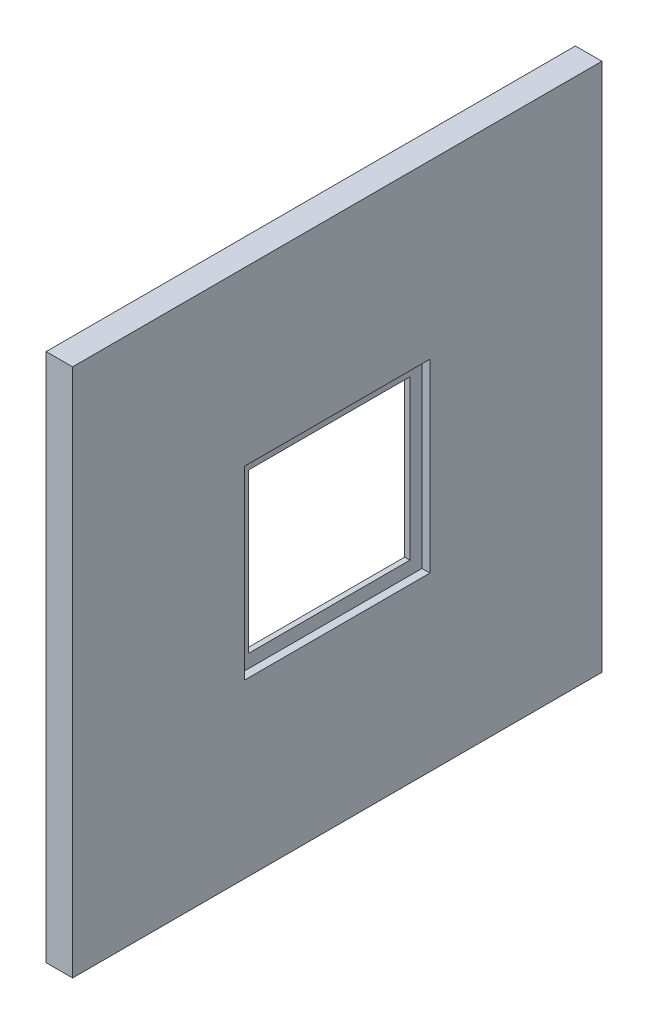
ISO-10303-21;
HEADER;
FILE_DESCRIPTION(('STEP AP214'),'2;1');
FILE_NAME('part.step','',(''),(''),'','','');
FILE_SCHEMA(('AUTOMOTIVE_DESIGN { 1 0 10303 214 1 1 1 1 }'));
ENDSEC;
DATA;
#1=APPLICATION_CONTEXT('core data for automotive mechanical design processes');
#2=APPLICATION_PROTOCOL_DEFINITION('international standard','automotive_design',2000,#1);
#3=PRODUCT_CONTEXT('',#1,'mechanical');
#4=PRODUCT('Part','Part','',(#3));
#5=PRODUCT_RELATED_PRODUCT_CATEGORY('part','',(#4));
#6=PRODUCT_DEFINITION_FORMATION('','',#4);
#7=PRODUCT_DEFINITION_CONTEXT('part definition',#1,'design');
#8=PRODUCT_DEFINITION('design','',#6,#7);
#9=PRODUCT_DEFINITION_SHAPE('','',#8);
#10=(LENGTH_UNIT() NAMED_UNIT(*) SI_UNIT(.MILLI.,.METRE.));
#11=(NAMED_UNIT(*) PLANE_ANGLE_UNIT() SI_UNIT($,.RADIAN.));
#12=(NAMED_UNIT(*) SI_UNIT($,.STERADIAN.) SOLID_ANGLE_UNIT());
#13=UNCERTAINTY_MEASURE_WITH_UNIT(LENGTH_MEASURE(1.E-05),#10,'distance_accuracy_value','');
#14=(GEOMETRIC_REPRESENTATION_CONTEXT(3) GLOBAL_UNCERTAINTY_ASSIGNED_CONTEXT((#13)) GLOBAL_UNIT_ASSIGNED_CONTEXT((#10,
#11,#12)) REPRESENTATION_CONTEXT('',''));
#15=CARTESIAN_POINT('',(0.,0.,0.));
#16=DIRECTION('',(0.,0.,1.));
#17=DIRECTION('',(1.,0.,0.));
#18=AXIS2_PLACEMENT_3D('',#15,#16,#17);
#19=CARTESIAN_POINT('',(10.,30.,-30.5107562106538));
#20=DIRECTION('',(0.,0.,-1.));
#21=DIRECTION('',(0.,1.,0.));
#22=AXIS2_PLACEMENT_3D('',#19,#20,#21);
#23=PLANE('',#22);
#24=DIRECTION('',(0.,-1.,0.));
#25=VECTOR('',#24,1.);
#26=CARTESIAN_POINT('',(7.,30.,-30.5107562106538));
#27=LINE('',#26,#25);
#28=CARTESIAN_POINT('',(7.,30.,-30.5107562106538));
#29=VERTEX_POINT('',#28);
#30=CARTESIAN_POINT('',(7.,-30.,-30.5107562106538));
#31=VERTEX_POINT('',#30);
#32=EDGE_CURVE('E62',#29,#31,#27,.T.);
#33=ORIENTED_EDGE('',*,*,#32,.F.);
#34=DIRECTION('',(-1.,0.,0.));
#35=VECTOR('',#34,1.);
#36=CARTESIAN_POINT('',(10.,30.,-30.5107562106538));
#37=LINE('',#36,#35);
#38=CARTESIAN_POINT('',(5.,30.,-30.5107562106538));
#39=VERTEX_POINT('',#38);
#40=EDGE_CURVE('E251',#29,#39,#37,.T.);
#41=ORIENTED_EDGE('',*,*,#40,.T.);
#42=DIRECTION('',(0.,-1.,0.));
#43=VECTOR('',#42,1.);
#44=CARTESIAN_POINT('',(5.,30.,-30.5107562106538));
#45=LINE('',#44,#43);
#46=CARTESIAN_POINT('',(5.,-30.,-30.5107562106538));
#47=VERTEX_POINT('',#46);
#48=EDGE_CURVE('E234',#39,#47,#45,.T.);
#49=ORIENTED_EDGE('',*,*,#48,.T.);
#50=DIRECTION('',(-1.,0.,0.));
#51=VECTOR('',#50,1.);
#52=CARTESIAN_POINT('',(10.,-30.,-30.5107562106538));
#53=LINE('',#52,#51);
#54=EDGE_CURVE('E250',#31,#47,#53,.T.);
#55=ORIENTED_EDGE('',*,*,#54,.F.);
#56=EDGE_LOOP('',(#33,#41,#49,#55));
#57=FACE_BOUND('',#56,.T.);
#58=ADVANCED_FACE('F39',(#57),#23,.F.);
#59=CARTESIAN_POINT('',(10.,30.,-30.5107562106538));
#60=DIRECTION('',(0.,1.,0.));
#61=DIRECTION('',(0.,0.,1.));
#62=AXIS2_PLACEMENT_3D('',#59,#60,#61);
#63=PLANE('',#62);
#64=DIRECTION('',(0.,0.,-1.));
#65=VECTOR('',#64,1.);
#66=CARTESIAN_POINT('',(7.,30.,-30.5107562106538));
#67=LINE('',#66,#65);
#68=CARTESIAN_POINT('',(7.,30.,30.5107562106538));
#69=VERTEX_POINT('',#68);
#70=EDGE_CURVE('E229',#69,#29,#67,.T.);
#71=ORIENTED_EDGE('',*,*,#70,.F.);
#72=DIRECTION('',(-1.,0.,0.));
#73=VECTOR('',#72,1.);
#74=CARTESIAN_POINT('',(10.,30.,30.5107562106538));
#75=LINE('',#74,#73);
#76=CARTESIAN_POINT('',(5.,30.,30.5107562106538));
#77=VERTEX_POINT('',#76);
#78=EDGE_CURVE('E255',#69,#77,#75,.T.);
#79=ORIENTED_EDGE('',*,*,#78,.T.);
#80=DIRECTION('',(0.,0.,-1.));
#81=VECTOR('',#80,1.);
#82=CARTESIAN_POINT('',(5.,30.,-30.5107562106538));
#83=LINE('',#82,#81);
#84=EDGE_CURVE('E246',#77,#39,#83,.T.);
#85=ORIENTED_EDGE('',*,*,#84,.T.);
#86=ORIENTED_EDGE('',*,*,#40,.F.);
#87=EDGE_LOOP('',(#71,#79,#85,#86));
#88=FACE_BOUND('',#87,.T.);
#89=ADVANCED_FACE('F421',(#88),#63,.F.);
#90=CARTESIAN_POINT('',(10.,30.,30.5107562106538));
#91=DIRECTION('',(0.,0.,1.));
#92=DIRECTION('',(0.,-1.,0.));
#93=AXIS2_PLACEMENT_3D('',#90,#91,#92);
#94=PLANE('',#93);
#95=DIRECTION('',(0.,1.,0.));
#96=VECTOR('',#95,1.);
#97=CARTESIAN_POINT('',(7.,30.,30.5107562106538));
#98=LINE('',#97,#96);
#99=CARTESIAN_POINT('',(7.,-30.,30.5107562106538));
#100=VERTEX_POINT('',#99);
#101=EDGE_CURVE('E221',#100,#69,#98,.T.);
#102=ORIENTED_EDGE('',*,*,#101,.F.);
#103=DIRECTION('',(-1.,0.,0.));
#104=VECTOR('',#103,1.);
#105=CARTESIAN_POINT('',(10.,-30.,30.5107562106538));
#106=LINE('',#105,#104);
#107=CARTESIAN_POINT('',(5.,-30.,30.5107562106538));
#108=VERTEX_POINT('',#107);
#109=EDGE_CURVE('E258',#100,#108,#106,.T.);
#110=ORIENTED_EDGE('',*,*,#109,.T.);
#111=DIRECTION('',(0.,1.,0.));
#112=VECTOR('',#111,1.);
#113=CARTESIAN_POINT('',(5.,30.,30.5107562106538));
#114=LINE('',#113,#112);
#115=EDGE_CURVE('E242',#108,#77,#114,.T.);
#116=ORIENTED_EDGE('',*,*,#115,.T.);
#117=ORIENTED_EDGE('',*,*,#78,.F.);
#118=EDGE_LOOP('',(#102,#110,#116,#117));
#119=FACE_BOUND('',#118,.T.);
#120=ADVANCED_FACE('F427',(#119),#94,.F.);
#121=CARTESIAN_POINT('',(10.,-30.,-30.5107562106538));
#122=DIRECTION('',(0.,-1.,0.));
#123=DIRECTION('',(0.,0.,-1.));
#124=AXIS2_PLACEMENT_3D('',#121,#122,#123);
#125=PLANE('',#124);
#126=DIRECTION('',(0.,0.,1.));
#127=VECTOR('',#126,1.);
#128=CARTESIAN_POINT('',(7.,-30.,-30.5107562106538));
#129=LINE('',#128,#127);
#130=EDGE_CURVE('E11',#31,#100,#129,.T.);
#131=ORIENTED_EDGE('',*,*,#130,.F.);
#132=ORIENTED_EDGE('',*,*,#54,.T.);
#133=DIRECTION('',(0.,0.,1.));
#134=VECTOR('',#133,1.);
#135=CARTESIAN_POINT('',(5.,-30.,-30.5107562106538));
#136=LINE('',#135,#134);
#137=EDGE_CURVE('E238',#47,#108,#136,.T.);
#138=ORIENTED_EDGE('',*,*,#137,.T.);
#139=ORIENTED_EDGE('',*,*,#109,.F.);
#140=EDGE_LOOP('',(#131,#132,#138,#139));
#141=FACE_BOUND('',#140,.T.);
#142=ADVANCED_FACE('F432',(#141),#125,.F.);
#143=CARTESIAN_POINT('',(0.,0.,0.));
#144=DIRECTION('',(1.,0.,0.));
#145=DIRECTION('',(0.,0.,-1.));
#146=AXIS2_PLACEMENT_3D('',#143,#144,#145);
#147=PLANE('',#146);
#148=DIRECTION('',(0.,-1.,0.));
#149=VECTOR('',#148,1.);
#150=CARTESIAN_POINT('',(0.,100.,100.));
#151=LINE('',#150,#149);
#152=CARTESIAN_POINT('',(0.,100.,100.));
#153=VERTEX_POINT('',#152);
#154=CARTESIAN_POINT('',(0.,-100.,100.));
#155=VERTEX_POINT('',#154);
#156=EDGE_CURVE('E325',#153,#155,#151,.T.);
#157=ORIENTED_EDGE('',*,*,#156,.F.);
#158=DIRECTION('',(0.,0.,1.));
#159=VECTOR('',#158,1.);
#160=CARTESIAN_POINT('',(0.,100.,100.));
#161=LINE('',#160,#159);
#162=CARTESIAN_POINT('',(0.,100.,-100.));
#163=VERTEX_POINT('',#162);
#164=EDGE_CURVE('E352',#163,#153,#161,.T.);
#165=ORIENTED_EDGE('',*,*,#164,.F.);
#166=DIRECTION('',(0.,1.,0.));
#167=VECTOR('',#166,1.);
#168=CARTESIAN_POINT('',(0.,100.,-100.));
#169=LINE('',#168,#167);
#170=CARTESIAN_POINT('',(0.,-100.,-100.));
#171=VERTEX_POINT('',#170);
#172=EDGE_CURVE('E368',#171,#163,#169,.T.);
#173=ORIENTED_EDGE('',*,*,#172,.F.);
#174=DIRECTION('',(0.,0.,-1.));
#175=VECTOR('',#174,1.);
#176=CARTESIAN_POINT('',(0.,-100.,100.));
#177=LINE('',#176,#175);
#178=EDGE_CURVE('E365',#155,#171,#177,.T.);
#179=ORIENTED_EDGE('',*,*,#178,.F.);
#180=EDGE_LOOP('',(#157,#165,#173,#179));
#181=FACE_BOUND('',#180,.T.);
#182=DIRECTION('',(0.,0.,1.));
#183=VECTOR('',#182,1.);
#184=CARTESIAN_POINT('',(0.,36.5,0.));
#185=LINE('',#184,#183);
#186=CARTESIAN_POINT('',(0.,36.5,25.709845908582));
#187=VERTEX_POINT('',#186);
#188=CARTESIAN_POINT('',(0.,36.5,36.5));
#189=VERTEX_POINT('',#188);
#190=EDGE_CURVE('E254',#187,#189,#185,.T.);
#191=ORIENTED_EDGE('',*,*,#190,.T.);
#192=DIRECTION('',(0.,-1.,0.));
#193=VECTOR('',#192,1.);
#194=CARTESIAN_POINT('',(0.,0.,36.5));
#195=LINE('',#194,#193);
#196=CARTESIAN_POINT('',(0.,-36.5,36.5));
#197=VERTEX_POINT('',#196);
#198=EDGE_CURVE('E268',#189,#197,#195,.T.);
#199=ORIENTED_EDGE('',*,*,#198,.T.);
#200=DIRECTION('',(0.,0.,1.));
#201=VECTOR('',#200,1.);
#202=CARTESIAN_POINT('',(0.,-36.5,0.));
#203=LINE('',#202,#201);
#204=CARTESIAN_POINT('',(0.,-36.5,-36.5));
#205=VERTEX_POINT('',#204);
#206=EDGE_CURVE('E314',#205,#197,#203,.T.);
#207=ORIENTED_EDGE('',*,*,#206,.F.);
#208=DIRECTION('',(0.,1.,0.));
#209=VECTOR('',#208,1.);
#210=CARTESIAN_POINT('',(0.,0.,-36.5));
#211=LINE('',#210,#209);
#212=CARTESIAN_POINT('',(0.,36.5,-36.5));
#213=VERTEX_POINT('',#212);
#214=EDGE_CURVE('E310',#205,#213,#211,.T.);
#215=ORIENTED_EDGE('',*,*,#214,.T.);
#216=DIRECTION('',(0.,0.,1.));
#217=VECTOR('',#216,1.);
#218=CARTESIAN_POINT('',(0.,36.5,0.));
#219=LINE('',#218,#217);
#220=CARTESIAN_POINT('',(0.,36.5,-25.709845908582));
#221=VERTEX_POINT('',#220);
#222=EDGE_CURVE('E306',#213,#221,#219,.T.);
#223=ORIENTED_EDGE('',*,*,#222,.T.);
#224=DIRECTION('',(0.,0.401990062035198,0.915644030191284));
#225=VECTOR('',#224,1.);
#226=CARTESIAN_POINT('',(0.,40.0650205887948,-17.589521234105));
#227=LINE('',#226,#225);
#228=CARTESIAN_POINT('',(0.,45.5,-5.209845908582));
#229=VERTEX_POINT('',#228);
#230=EDGE_CURVE('E302',#221,#229,#227,.T.);
#231=ORIENTED_EDGE('',*,*,#230,.T.);
#232=DIRECTION('',(0.,0.,1.));
#233=VECTOR('',#232,1.);
#234=CARTESIAN_POINT('',(0.,45.5,0.));
#235=LINE('',#234,#233);
#236=CARTESIAN_POINT('',(0.,45.5,5.20984590858205));
#237=VERTEX_POINT('',#236);
#238=EDGE_CURVE('E298',#229,#237,#235,.T.);
#239=ORIENTED_EDGE('',*,*,#238,.T.);
#240=DIRECTION('',(0.,-0.401990062035199,0.915644030191284));
#241=VECTOR('',#240,1.);
#242=CARTESIAN_POINT('',(0.,40.0650205887948,17.5895212341051));
#243=LINE('',#242,#241);
#244=EDGE_CURVE('E294',#237,#187,#243,.T.);
#245=ORIENTED_EDGE('',*,*,#244,.T.);
#246=EDGE_LOOP('',(#191,#199,#207,#215,#223,#231,#239,#245));
#247=FACE_BOUND('',#246,.T.);
#248=ADVANCED_FACE('F395',(#181,#247),#147,.F.);
#249=CARTESIAN_POINT('',(10.,100.,100.));
#250=DIRECTION('',(0.,0.,-1.));
#251=DIRECTION('',(0.,1.,0.));
#252=AXIS2_PLACEMENT_3D('',#249,#250,#251);
#253=PLANE('',#252);
#254=ORIENTED_EDGE('',*,*,#156,.T.);
#255=DIRECTION('',(-1.,0.,0.));
#256=VECTOR('',#255,1.);
#257=CARTESIAN_POINT('',(10.,-100.,100.));
#258=LINE('',#257,#256);
#259=CARTESIAN_POINT('',(10.,-100.,100.));
#260=VERTEX_POINT('',#259);
#261=EDGE_CURVE('E48',#260,#155,#258,.T.);
#262=ORIENTED_EDGE('',*,*,#261,.F.);
#263=DIRECTION('',(0.,-1.,0.));
#264=VECTOR('',#263,1.);
#265=CARTESIAN_POINT('',(10.,100.,100.));
#266=LINE('',#265,#264);
#267=CARTESIAN_POINT('',(10.,100.,100.));
#268=VERTEX_POINT('',#267);
#269=EDGE_CURVE('E347',#268,#260,#266,.T.);
#270=ORIENTED_EDGE('',*,*,#269,.F.);
#271=DIRECTION('',(-1.,0.,0.));
#272=VECTOR('',#271,1.);
#273=CARTESIAN_POINT('',(10.,100.,100.));
#274=LINE('',#273,#272);
#275=EDGE_CURVE('E361',#268,#153,#274,.T.);
#276=ORIENTED_EDGE('',*,*,#275,.T.);
#277=EDGE_LOOP('',(#254,#262,#270,#276));
#278=FACE_BOUND('',#277,.T.);
#279=ADVANCED_FACE('F41',(#278),#253,.F.);
#280=CARTESIAN_POINT('',(10.,-100.,100.));
#281=DIRECTION('',(0.,1.,0.));
#282=DIRECTION('',(0.,0.,1.));
#283=AXIS2_PLACEMENT_3D('',#280,#281,#282);
#284=PLANE('',#283);
#285=ORIENTED_EDGE('',*,*,#178,.T.);
#286=DIRECTION('',(-1.,0.,0.));
#287=VECTOR('',#286,1.);
#288=CARTESIAN_POINT('',(10.,-100.,-100.));
#289=LINE('',#288,#287);
#290=CARTESIAN_POINT('',(10.,-100.,-100.));
#291=VERTEX_POINT('',#290);
#292=EDGE_CURVE('E380',#291,#171,#289,.T.);
#293=ORIENTED_EDGE('',*,*,#292,.F.);
#294=DIRECTION('',(0.,0.,-1.));
#295=VECTOR('',#294,1.);
#296=CARTESIAN_POINT('',(10.,-100.,100.));
#297=LINE('',#296,#295);
#298=EDGE_CURVE('E351',#260,#291,#297,.T.);
#299=ORIENTED_EDGE('',*,*,#298,.F.);
#300=ORIENTED_EDGE('',*,*,#261,.T.);
#301=EDGE_LOOP('',(#285,#293,#299,#300));
#302=FACE_BOUND('',#301,.T.);
#303=ADVANCED_FACE('F387',(#302),#284,.F.);
#304=CARTESIAN_POINT('',(10.,100.,-100.));
#305=DIRECTION('',(0.,0.,1.));
#306=DIRECTION('',(1.,0.,0.));
#307=AXIS2_PLACEMENT_3D('',#304,#305,#306);
#308=PLANE('',#307);
#309=ORIENTED_EDGE('',*,*,#172,.T.);
#310=DIRECTION('',(-1.,0.,0.));
#311=VECTOR('',#310,1.);
#312=CARTESIAN_POINT('',(10.,100.,-100.));
#313=LINE('',#312,#311);
#314=CARTESIAN_POINT('',(10.,100.,-100.));
#315=VERTEX_POINT('',#314);
#316=EDGE_CURVE('E376',#315,#163,#313,.T.);
#317=ORIENTED_EDGE('',*,*,#316,.F.);
#318=DIRECTION('',(0.,1.,0.));
#319=VECTOR('',#318,1.);
#320=CARTESIAN_POINT('',(10.,100.,-100.));
#321=LINE('',#320,#319);
#322=EDGE_CURVE('E355',#291,#315,#321,.T.);
#323=ORIENTED_EDGE('',*,*,#322,.F.);
#324=ORIENTED_EDGE('',*,*,#292,.T.);
#325=EDGE_LOOP('',(#309,#317,#323,#324));
#326=FACE_BOUND('',#325,.T.);
#327=ADVANCED_FACE('F400',(#326),#308,.F.);
#328=CARTESIAN_POINT('',(10.,100.,100.));
#329=DIRECTION('',(0.,-1.,0.));
#330=DIRECTION('',(0.,0.,-1.));
#331=AXIS2_PLACEMENT_3D('',#328,#329,#330);
#332=PLANE('',#331);
#333=ORIENTED_EDGE('',*,*,#164,.T.);
#334=ORIENTED_EDGE('',*,*,#275,.F.);
#335=DIRECTION('',(0.,0.,1.));
#336=VECTOR('',#335,1.);
#337=CARTESIAN_POINT('',(10.,100.,100.));
#338=LINE('',#337,#336);
#339=EDGE_CURVE('E358',#315,#268,#338,.T.);
#340=ORIENTED_EDGE('',*,*,#339,.F.);
#341=ORIENTED_EDGE('',*,*,#316,.T.);
#342=EDGE_LOOP('',(#333,#334,#340,#341));
#343=FACE_BOUND('',#342,.T.);
#344=ADVANCED_FACE('F404',(#343),#332,.F.);
#345=CARTESIAN_POINT('',(10.,0.,0.));
#346=DIRECTION('',(1.,0.,0.));
#347=DIRECTION('',(0.,0.,-1.));
#348=AXIS2_PLACEMENT_3D('',#345,#346,#347);
#349=PLANE('',#348);
#350=DIRECTION('',(0.,-1.,0.));
#351=VECTOR('',#350,1.);
#352=CARTESIAN_POINT('',(10.,35.,35.));
#353=LINE('',#352,#351);
#354=CARTESIAN_POINT('',(10.,35.,35.));
#355=VERTEX_POINT('',#354);
#356=CARTESIAN_POINT('',(10.,-35.,35.));
#357=VERTEX_POINT('',#356);
#358=EDGE_CURVE('E55',#355,#357,#353,.T.);
#359=ORIENTED_EDGE('',*,*,#358,.F.);
#360=DIRECTION('',(0.,0.,1.));
#361=VECTOR('',#360,1.);
#362=CARTESIAN_POINT('',(10.,35.,35.));
#363=LINE('',#362,#361);
#364=CARTESIAN_POINT('',(10.,35.,-35.));
#365=VERTEX_POINT('',#364);
#366=EDGE_CURVE('E199',#365,#355,#363,.T.);
#367=ORIENTED_EDGE('',*,*,#366,.F.);
#368=DIRECTION('',(0.,1.,0.));
#369=VECTOR('',#368,1.);
#370=CARTESIAN_POINT('',(10.,35.,-35.));
#371=LINE('',#370,#369);
#372=CARTESIAN_POINT('',(10.,-35.,-35.));
#373=VERTEX_POINT('',#372);
#374=EDGE_CURVE('E203',#373,#365,#371,.T.);
#375=ORIENTED_EDGE('',*,*,#374,.F.);
#376=DIRECTION('',(0.,0.,-1.));
#377=VECTOR('',#376,1.);
#378=CARTESIAN_POINT('',(10.,-35.,35.));
#379=LINE('',#378,#377);
#380=EDGE_CURVE('E212',#357,#373,#379,.T.);
#381=ORIENTED_EDGE('',*,*,#380,.F.);
#382=EDGE_LOOP('',(#359,#367,#375,#381));
#383=FACE_BOUND('',#382,.T.);
#384=ORIENTED_EDGE('',*,*,#269,.T.);
#385=ORIENTED_EDGE('',*,*,#298,.T.);
#386=ORIENTED_EDGE('',*,*,#322,.T.);
#387=ORIENTED_EDGE('',*,*,#339,.T.);
#388=EDGE_LOOP('',(#384,#385,#386,#387));
#389=FACE_BOUND('',#388,.T.);
#390=ADVANCED_FACE('F406',(#383,#389),#349,.T.);
#391=CARTESIAN_POINT('',(5.,36.5,0.));
#392=DIRECTION('',(0.,-1.,0.));
#393=DIRECTION('',(0.,0.,-1.));
#394=AXIS2_PLACEMENT_3D('',#391,#392,#393);
#395=PLANE('',#394);
#396=ORIENTED_EDGE('',*,*,#190,.F.);
#397=DIRECTION('',(-1.,0.,0.));
#398=VECTOR('',#397,1.);
#399=CARTESIAN_POINT('',(5.,36.5,25.709845908582));
#400=LINE('',#399,#398);
#401=CARTESIAN_POINT('',(5.,36.5,25.709845908582));
#402=VERTEX_POINT('',#401);
#403=EDGE_CURVE('E290',#402,#187,#400,.T.);
#404=ORIENTED_EDGE('',*,*,#403,.F.);
#405=DIRECTION('',(0.,0.,1.));
#406=VECTOR('',#405,1.);
#407=CARTESIAN_POINT('',(5.,36.5,0.));
#408=LINE('',#407,#406);
#409=CARTESIAN_POINT('',(5.,36.5,36.5));
#410=VERTEX_POINT('',#409);
#411=EDGE_CURVE('E263',#402,#410,#408,.T.);
#412=ORIENTED_EDGE('',*,*,#411,.T.);
#413=DIRECTION('',(-1.,0.,0.));
#414=VECTOR('',#413,1.);
#415=CARTESIAN_POINT('',(5.,36.5,36.5));
#416=LINE('',#415,#414);
#417=EDGE_CURVE('E321',#410,#189,#416,.T.);
#418=ORIENTED_EDGE('',*,*,#417,.T.);
#419=EDGE_LOOP('',(#396,#404,#412,#418));
#420=FACE_BOUND('',#419,.T.);
#421=ADVANCED_FACE('F408',(#420),#395,.T.);
#422=CARTESIAN_POINT('',(5.,0.,36.5));
#423=DIRECTION('',(0.,0.,-1.));
#424=DIRECTION('',(-1.,0.,0.));
#425=AXIS2_PLACEMENT_3D('',#422,#423,#424);
#426=PLANE('',#425);
#427=ORIENTED_EDGE('',*,*,#198,.F.);
#428=ORIENTED_EDGE('',*,*,#417,.F.);
#429=DIRECTION('',(0.,-1.,0.));
#430=VECTOR('',#429,1.);
#431=CARTESIAN_POINT('',(5.,0.,36.5));
#432=LINE('',#431,#430);
#433=CARTESIAN_POINT('',(5.,-36.5,36.5));
#434=VERTEX_POINT('',#433);
#435=EDGE_CURVE('E287',#410,#434,#432,.T.);
#436=ORIENTED_EDGE('',*,*,#435,.T.);
#437=DIRECTION('',(-1.,0.,0.));
#438=VECTOR('',#437,1.);
#439=CARTESIAN_POINT('',(5.,-36.5,36.5));
#440=LINE('',#439,#438);
#441=EDGE_CURVE('E326',#434,#197,#440,.T.);
#442=ORIENTED_EDGE('',*,*,#441,.T.);
#443=EDGE_LOOP('',(#427,#428,#436,#442));
#444=FACE_BOUND('',#443,.T.);
#445=ADVANCED_FACE('F415',(#444),#426,.T.);
#446=CARTESIAN_POINT('',(5.,-36.5,0.));
#447=DIRECTION('',(0.,-1.,0.));
#448=DIRECTION('',(0.,0.,-1.));
#449=AXIS2_PLACEMENT_3D('',#446,#447,#448);
#450=PLANE('',#449);
#451=ORIENTED_EDGE('',*,*,#206,.T.);
#452=ORIENTED_EDGE('',*,*,#441,.F.);
#453=DIRECTION('',(0.,0.,1.));
#454=VECTOR('',#453,1.);
#455=CARTESIAN_POINT('',(5.,-36.5,0.));
#456=LINE('',#455,#454);
#457=CARTESIAN_POINT('',(5.,-36.5,-36.5));
#458=VERTEX_POINT('',#457);
#459=EDGE_CURVE('E283',#458,#434,#456,.T.);
#460=ORIENTED_EDGE('',*,*,#459,.F.);
#461=DIRECTION('',(-1.,0.,0.));
#462=VECTOR('',#461,1.);
#463=CARTESIAN_POINT('',(5.,-36.5,-36.5));
#464=LINE('',#463,#462);
#465=EDGE_CURVE('E329',#458,#205,#464,.T.);
#466=ORIENTED_EDGE('',*,*,#465,.T.);
#467=EDGE_LOOP('',(#451,#452,#460,#466));
#468=FACE_BOUND('',#467,.T.);
#469=ADVANCED_FACE('F441',(#468),#450,.F.);
#470=CARTESIAN_POINT('',(5.,0.,-36.5));
#471=DIRECTION('',(0.,0.,1.));
#472=DIRECTION('',(1.,0.,0.));
#473=AXIS2_PLACEMENT_3D('',#470,#471,#472);
#474=PLANE('',#473);
#475=ORIENTED_EDGE('',*,*,#214,.F.);
#476=ORIENTED_EDGE('',*,*,#465,.F.);
#477=DIRECTION('',(0.,1.,0.));
#478=VECTOR('',#477,1.);
#479=CARTESIAN_POINT('',(5.,0.,-36.5));
#480=LINE('',#479,#478);
#481=CARTESIAN_POINT('',(5.,36.5,-36.5));
#482=VERTEX_POINT('',#481);
#483=EDGE_CURVE('E280',#458,#482,#480,.T.);
#484=ORIENTED_EDGE('',*,*,#483,.T.);
#485=DIRECTION('',(-1.,0.,0.));
#486=VECTOR('',#485,1.);
#487=CARTESIAN_POINT('',(5.,36.5,-36.5));
#488=LINE('',#487,#486);
#489=EDGE_CURVE('E332',#482,#213,#488,.T.);
#490=ORIENTED_EDGE('',*,*,#489,.T.);
#491=EDGE_LOOP('',(#475,#476,#484,#490));
#492=FACE_BOUND('',#491,.T.);
#493=ADVANCED_FACE('F445',(#492),#474,.T.);
#494=CARTESIAN_POINT('',(5.,36.5,0.));
#495=DIRECTION('',(0.,-1.,0.));
#496=DIRECTION('',(0.,0.,-1.));
#497=AXIS2_PLACEMENT_3D('',#494,#495,#496);
#498=PLANE('',#497);
#499=ORIENTED_EDGE('',*,*,#222,.F.);
#500=ORIENTED_EDGE('',*,*,#489,.F.);
#501=DIRECTION('',(0.,0.,1.));
#502=VECTOR('',#501,1.);
#503=CARTESIAN_POINT('',(5.,36.5,0.));
#504=LINE('',#503,#502);
#505=CARTESIAN_POINT('',(5.,36.5,-25.709845908582));
#506=VERTEX_POINT('',#505);
#507=EDGE_CURVE('E277',#482,#506,#504,.T.);
#508=ORIENTED_EDGE('',*,*,#507,.T.);
#509=DIRECTION('',(-1.,0.,0.));
#510=VECTOR('',#509,1.);
#511=CARTESIAN_POINT('',(5.,36.5,-25.709845908582));
#512=LINE('',#511,#510);
#513=EDGE_CURVE('E335',#506,#221,#512,.T.);
#514=ORIENTED_EDGE('',*,*,#513,.T.);
#515=EDGE_LOOP('',(#499,#500,#508,#514));
#516=FACE_BOUND('',#515,.T.);
#517=ADVANCED_FACE('F449',(#516),#498,.T.);
#518=CARTESIAN_POINT('',(5.,40.0650205887948,-17.589521234105));
#519=DIRECTION('',(0.,-0.915644030191284,0.401990062035198));
#520=DIRECTION('',(0.,-0.401990062035198,-0.915644030191284));
#521=AXIS2_PLACEMENT_3D('',#518,#519,#520);
#522=PLANE('',#521);
#523=ORIENTED_EDGE('',*,*,#230,.F.);
#524=ORIENTED_EDGE('',*,*,#513,.F.);
#525=DIRECTION('',(0.,0.401990062035198,0.915644030191284));
#526=VECTOR('',#525,1.);
#527=CARTESIAN_POINT('',(5.,40.0650205887948,-17.589521234105));
#528=LINE('',#527,#526);
#529=CARTESIAN_POINT('',(5.,45.5,-5.209845908582));
#530=VERTEX_POINT('',#529);
#531=EDGE_CURVE('E274',#506,#530,#528,.T.);
#532=ORIENTED_EDGE('',*,*,#531,.T.);
#533=DIRECTION('',(-1.,0.,0.));
#534=VECTOR('',#533,1.);
#535=CARTESIAN_POINT('',(5.,45.5,-5.209845908582));
#536=LINE('',#535,#534);
#537=EDGE_CURVE('E338',#530,#229,#536,.T.);
#538=ORIENTED_EDGE('',*,*,#537,.T.);
#539=EDGE_LOOP('',(#523,#524,#532,#538));
#540=FACE_BOUND('',#539,.T.);
#541=ADVANCED_FACE('F453',(#540),#522,.T.);
#542=CARTESIAN_POINT('',(5.,45.5,0.));
#543=DIRECTION('',(0.,-1.,0.));
#544=DIRECTION('',(0.,0.,-1.));
#545=AXIS2_PLACEMENT_3D('',#542,#543,#544);
#546=PLANE('',#545);
#547=ORIENTED_EDGE('',*,*,#238,.F.);
#548=ORIENTED_EDGE('',*,*,#537,.F.);
#549=DIRECTION('',(0.,0.,1.));
#550=VECTOR('',#549,1.);
#551=CARTESIAN_POINT('',(5.,45.5,0.));
#552=LINE('',#551,#550);
#553=CARTESIAN_POINT('',(5.,45.5,5.20984590858205));
#554=VERTEX_POINT('',#553);
#555=EDGE_CURVE('E271',#530,#554,#552,.T.);
#556=ORIENTED_EDGE('',*,*,#555,.T.);
#557=DIRECTION('',(-1.,0.,0.));
#558=VECTOR('',#557,1.);
#559=CARTESIAN_POINT('',(5.,45.5,5.20984590858205));
#560=LINE('',#559,#558);
#561=EDGE_CURVE('E341',#554,#237,#560,.T.);
#562=ORIENTED_EDGE('',*,*,#561,.T.);
#563=EDGE_LOOP('',(#547,#548,#556,#562));
#564=FACE_BOUND('',#563,.T.);
#565=ADVANCED_FACE('F457',(#564),#546,.T.);
#566=CARTESIAN_POINT('',(5.,40.0650205887948,17.5895212341051));
#567=DIRECTION('',(0.,-0.915644030191284,-0.401990062035199));
#568=DIRECTION('',(0.,0.401990062035199,-0.915644030191284));
#569=AXIS2_PLACEMENT_3D('',#566,#567,#568);
#570=PLANE('',#569);
#571=ORIENTED_EDGE('',*,*,#244,.F.);
#572=ORIENTED_EDGE('',*,*,#561,.F.);
#573=DIRECTION('',(0.,-0.401990062035199,0.915644030191284));
#574=VECTOR('',#573,1.);
#575=CARTESIAN_POINT('',(5.,40.0650205887948,17.5895212341051));
#576=LINE('',#575,#574);
#577=EDGE_CURVE('E267',#554,#402,#576,.T.);
#578=ORIENTED_EDGE('',*,*,#577,.T.);
#579=ORIENTED_EDGE('',*,*,#403,.T.);
#580=EDGE_LOOP('',(#571,#572,#578,#579));
#581=FACE_BOUND('',#580,.T.);
#582=ADVANCED_FACE('F437',(#581),#570,.T.);
#583=CARTESIAN_POINT('',(5.,0.,0.));
#584=DIRECTION('',(-1.,0.,0.));
#585=DIRECTION('',(0.,0.,1.));
#586=AXIS2_PLACEMENT_3D('',#583,#584,#585);
#587=PLANE('',#586);
#588=ORIENTED_EDGE('',*,*,#48,.F.);
#589=ORIENTED_EDGE('',*,*,#84,.F.);
#590=ORIENTED_EDGE('',*,*,#115,.F.);
#591=ORIENTED_EDGE('',*,*,#137,.F.);
#592=EDGE_LOOP('',(#588,#589,#590,#591));
#593=FACE_BOUND('',#592,.T.);
#594=ORIENTED_EDGE('',*,*,#411,.F.);
#595=ORIENTED_EDGE('',*,*,#577,.F.);
#596=ORIENTED_EDGE('',*,*,#555,.F.);
#597=ORIENTED_EDGE('',*,*,#531,.F.);
#598=ORIENTED_EDGE('',*,*,#507,.F.);
#599=ORIENTED_EDGE('',*,*,#483,.F.);
#600=ORIENTED_EDGE('',*,*,#459,.T.);
#601=ORIENTED_EDGE('',*,*,#435,.F.);
#602=EDGE_LOOP('',(#594,#595,#596,#597,#598,#599,#600,#601));
#603=FACE_BOUND('',#602,.T.);
#604=ADVANCED_FACE('F434',(#593,#603),#587,.T.);
#605=CARTESIAN_POINT('',(7.,0.,0.));
#606=DIRECTION('',(1.,0.,0.));
#607=DIRECTION('',(0.,0.,-1.));
#608=AXIS2_PLACEMENT_3D('',#605,#606,#607);
#609=PLANE('',#608);
#610=DIRECTION('',(0.,-1.,0.));
#611=VECTOR('',#610,1.);
#612=CARTESIAN_POINT('',(7.,35.,35.));
#613=LINE('',#612,#611);
#614=CARTESIAN_POINT('',(7.,35.,35.));
#615=VERTEX_POINT('',#614);
#616=CARTESIAN_POINT('',(7.,-35.,35.));
#617=VERTEX_POINT('',#616);
#618=EDGE_CURVE('E178',#615,#617,#613,.T.);
#619=ORIENTED_EDGE('',*,*,#618,.T.);
#620=DIRECTION('',(0.,0.,-1.));
#621=VECTOR('',#620,1.);
#622=CARTESIAN_POINT('',(7.,-35.,35.));
#623=LINE('',#622,#621);
#624=CARTESIAN_POINT('',(7.,-35.,-35.));
#625=VERTEX_POINT('',#624);
#626=EDGE_CURVE('E188',#617,#625,#623,.T.);
#627=ORIENTED_EDGE('',*,*,#626,.T.);
#628=DIRECTION('',(0.,1.,0.));
#629=VECTOR('',#628,1.);
#630=CARTESIAN_POINT('',(7.,35.,-35.));
#631=LINE('',#630,#629);
#632=CARTESIAN_POINT('',(7.,35.,-35.));
#633=VERTEX_POINT('',#632);
#634=EDGE_CURVE('E194',#625,#633,#631,.T.);
#635=ORIENTED_EDGE('',*,*,#634,.T.);
#636=DIRECTION('',(0.,0.,1.));
#637=VECTOR('',#636,1.);
#638=CARTESIAN_POINT('',(7.,35.,35.));
#639=LINE('',#638,#637);
#640=EDGE_CURVE('E185',#633,#615,#639,.T.);
#641=ORIENTED_EDGE('',*,*,#640,.T.);
#642=EDGE_LOOP('',(#619,#627,#635,#641));
#643=FACE_BOUND('',#642,.T.);
#644=ORIENTED_EDGE('',*,*,#32,.T.);
#645=ORIENTED_EDGE('',*,*,#130,.T.);
#646=ORIENTED_EDGE('',*,*,#101,.T.);
#647=ORIENTED_EDGE('',*,*,#70,.T.);
#648=EDGE_LOOP('',(#644,#645,#646,#647));
#649=FACE_BOUND('',#648,.T.);
#650=ADVANCED_FACE('F196',(#643,#649),#609,.T.);
#651=CARTESIAN_POINT('',(7.,35.,35.));
#652=DIRECTION('',(0.,0.,1.));
#653=DIRECTION('',(0.,-1.,0.));
#654=AXIS2_PLACEMENT_3D('',#651,#652,#653);
#655=PLANE('',#654);
#656=ORIENTED_EDGE('',*,*,#358,.T.);
#657=DIRECTION('',(1.,0.,0.));
#658=VECTOR('',#657,1.);
#659=CARTESIAN_POINT('',(7.,-35.,35.));
#660=LINE('',#659,#658);
#661=EDGE_CURVE('E174',#617,#357,#660,.T.);
#662=ORIENTED_EDGE('',*,*,#661,.F.);
#663=ORIENTED_EDGE('',*,*,#618,.F.);
#664=DIRECTION('',(1.,0.,0.));
#665=VECTOR('',#664,1.);
#666=CARTESIAN_POINT('',(7.,35.,35.));
#667=LINE('',#666,#665);
#668=EDGE_CURVE('E218',#615,#355,#667,.T.);
#669=ORIENTED_EDGE('',*,*,#668,.T.);
#670=EDGE_LOOP('',(#656,#662,#663,#669));
#671=FACE_BOUND('',#670,.T.);
#672=ADVANCED_FACE('F176',(#671),#655,.F.);
#673=CARTESIAN_POINT('',(7.,35.,35.));
#674=DIRECTION('',(0.,1.,0.));
#675=DIRECTION('',(0.,0.,1.));
#676=AXIS2_PLACEMENT_3D('',#673,#674,#675);
#677=PLANE('',#676);
#678=ORIENTED_EDGE('',*,*,#366,.T.);
#679=ORIENTED_EDGE('',*,*,#668,.F.);
#680=ORIENTED_EDGE('',*,*,#640,.F.);
#681=DIRECTION('',(1.,0.,0.));
#682=VECTOR('',#681,1.);
#683=CARTESIAN_POINT('',(7.,35.,-35.));
#684=LINE('',#683,#682);
#685=EDGE_CURVE('E222',#633,#365,#684,.T.);
#686=ORIENTED_EDGE('',*,*,#685,.T.);
#687=EDGE_LOOP('',(#678,#679,#680,#686));
#688=FACE_BOUND('',#687,.T.);
#689=ADVANCED_FACE('F613',(#688),#677,.F.);
#690=CARTESIAN_POINT('',(7.,35.,-35.));
#691=DIRECTION('',(0.,0.,-1.));
#692=DIRECTION('',(0.,1.,0.));
#693=AXIS2_PLACEMENT_3D('',#690,#691,#692);
#694=PLANE('',#693);
#695=ORIENTED_EDGE('',*,*,#374,.T.);
#696=ORIENTED_EDGE('',*,*,#685,.F.);
#697=ORIENTED_EDGE('',*,*,#634,.F.);
#698=DIRECTION('',(1.,0.,0.));
#699=VECTOR('',#698,1.);
#700=CARTESIAN_POINT('',(7.,-35.,-35.));
#701=LINE('',#700,#699);
#702=EDGE_CURVE('E184',#625,#373,#701,.T.);
#703=ORIENTED_EDGE('',*,*,#702,.T.);
#704=EDGE_LOOP('',(#695,#696,#697,#703));
#705=FACE_BOUND('',#704,.T.);
#706=ADVANCED_FACE('F622',(#705),#694,.F.);
#707=CARTESIAN_POINT('',(7.,-35.,35.));
#708=DIRECTION('',(0.,-1.,0.));
#709=DIRECTION('',(0.,0.,-1.));
#710=AXIS2_PLACEMENT_3D('',#707,#708,#709);
#711=PLANE('',#710);
#712=ORIENTED_EDGE('',*,*,#380,.T.);
#713=ORIENTED_EDGE('',*,*,#702,.F.);
#714=ORIENTED_EDGE('',*,*,#626,.F.);
#715=ORIENTED_EDGE('',*,*,#661,.T.);
#716=EDGE_LOOP('',(#712,#713,#714,#715));
#717=FACE_BOUND('',#716,.T.);
#718=ADVANCED_FACE('F189',(#717),#711,.F.);
#719=CLOSED_SHELL('',(#58,#89,#120,#142,#248,#279,#303,#327,#344,#390,#421,#445,#469,#493,#517,
#541,#565,#582,#604,#650,#672,#689,#706,#718));
#720=MANIFOLD_SOLID_BREP('B2',#719);
#721=ADVANCED_BREP_SHAPE_REPRESENTATION('',(#18,#720),#14);
#722=SHAPE_DEFINITION_REPRESENTATION(#9,#721);
ENDSEC;
END-ISO-10303-21;
